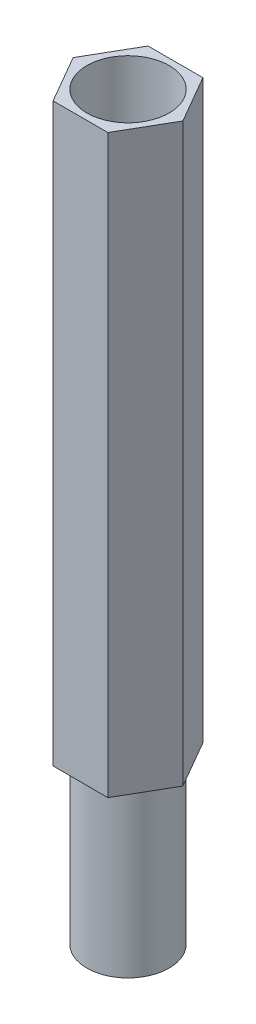
ISO-10303-21;
HEADER;
FILE_DESCRIPTION(('STEP AP214'),'2;1');
FILE_NAME('part.step','',(''),(''),'','','');
FILE_SCHEMA(('AUTOMOTIVE_DESIGN { 1 0 10303 214 1 1 1 1 }'));
ENDSEC;
DATA;
#1=APPLICATION_CONTEXT('core data for automotive mechanical design processes');
#2=APPLICATION_PROTOCOL_DEFINITION('international standard','automotive_design',2000,#1);
#3=PRODUCT_CONTEXT('',#1,'mechanical');
#4=PRODUCT('Part','Part','',(#3));
#5=PRODUCT_RELATED_PRODUCT_CATEGORY('part','',(#4));
#6=PRODUCT_DEFINITION_FORMATION('','',#4);
#7=PRODUCT_DEFINITION_CONTEXT('part definition',#1,'design');
#8=PRODUCT_DEFINITION('design','',#6,#7);
#9=PRODUCT_DEFINITION_SHAPE('','',#8);
#10=(LENGTH_UNIT() NAMED_UNIT(*) SI_UNIT(.MILLI.,.METRE.));
#11=(NAMED_UNIT(*) PLANE_ANGLE_UNIT() SI_UNIT($,.RADIAN.));
#12=(NAMED_UNIT(*) SI_UNIT($,.STERADIAN.) SOLID_ANGLE_UNIT());
#13=UNCERTAINTY_MEASURE_WITH_UNIT(LENGTH_MEASURE(1.E-05),#10,'distance_accuracy_value','');
#14=(GEOMETRIC_REPRESENTATION_CONTEXT(3) GLOBAL_UNCERTAINTY_ASSIGNED_CONTEXT((#13)) GLOBAL_UNIT_ASSIGNED_CONTEXT((#10,
#11,#12)) REPRESENTATION_CONTEXT('',''));
#15=CARTESIAN_POINT('',(0.,0.,0.));
#16=DIRECTION('',(0.,0.,1.));
#17=DIRECTION('',(1.,0.,0.));
#18=AXIS2_PLACEMENT_3D('',#15,#16,#17);
#19=CARTESIAN_POINT('',(0.,21.,0.));
#20=DIRECTION('',(0.,-1.,0.));
#21=DIRECTION('',(0.,0.,-1.));
#22=AXIS2_PLACEMENT_3D('',#19,#20,#21);
#23=PLANE('',#22);
#24=DIRECTION('',(-1.,0.,0.));
#25=VECTOR('',#24,1.);
#26=CARTESIAN_POINT('',(1.00000000000005,21.,1.73205080756897));
#27=LINE('',#26,#25);
#28=CARTESIAN_POINT('',(1.00000000000005,21.,1.73205080756897));
#29=VERTEX_POINT('',#28);
#30=CARTESIAN_POINT('',(-0.999999999999947,21.,1.73205080756897));
#31=VERTEX_POINT('',#30);
#32=EDGE_CURVE('E145',#29,#31,#27,.T.);
#33=ORIENTED_EDGE('',*,*,#32,.F.);
#34=DIRECTION('',(-0.5,0.,0.866025403784439));
#35=VECTOR('',#34,1.);
#36=CARTESIAN_POINT('',(2.00000000000011,21.,0.));
#37=LINE('',#36,#35);
#38=CARTESIAN_POINT('',(2.00000000000011,21.,0.));
#39=VERTEX_POINT('',#38);
#40=EDGE_CURVE('E119',#39,#29,#37,.T.);
#41=ORIENTED_EDGE('',*,*,#40,.F.);
#42=DIRECTION('',(0.5,0.,0.866025403784439));
#43=VECTOR('',#42,1.);
#44=CARTESIAN_POINT('',(1.00000000000005,21.,-1.73205080756897));
#45=LINE('',#44,#43);
#46=CARTESIAN_POINT('',(1.00000000000005,21.,-1.73205080756897));
#47=VERTEX_POINT('',#46);
#48=EDGE_CURVE('E104',#47,#39,#45,.T.);
#49=ORIENTED_EDGE('',*,*,#48,.F.);
#50=DIRECTION('',(1.,0.,0.));
#51=VECTOR('',#50,1.);
#52=CARTESIAN_POINT('',(-0.999999999999947,21.,-1.73205080756897));
#53=LINE('',#52,#51);
#54=CARTESIAN_POINT('',(-0.999999999999947,21.,-1.73205080756897));
#55=VERTEX_POINT('',#54);
#56=EDGE_CURVE('E117',#55,#47,#53,.T.);
#57=ORIENTED_EDGE('',*,*,#56,.F.);
#58=DIRECTION('',(0.5,0.,-0.866025403784439));
#59=VECTOR('',#58,1.);
#60=CARTESIAN_POINT('',(-2.,21.,0.));
#61=LINE('',#60,#59);
#62=CARTESIAN_POINT('',(-2.,21.,0.));
#63=VERTEX_POINT('',#62);
#64=EDGE_CURVE('E122',#63,#55,#61,.T.);
#65=ORIENTED_EDGE('',*,*,#64,.F.);
#66=DIRECTION('',(-0.5,0.,-0.866025403784439));
#67=VECTOR('',#66,1.);
#68=CARTESIAN_POINT('',(-0.999999999999947,21.,1.73205080756897));
#69=LINE('',#68,#67);
#70=EDGE_CURVE('E124',#31,#63,#69,.T.);
#71=ORIENTED_EDGE('',*,*,#70,.F.);
#72=EDGE_LOOP('',(#33,#41,#49,#57,#65,#71));
#73=FACE_BOUND('',#72,.T.);
#74=CARTESIAN_POINT('',(0.,21.,0.));
#75=DIRECTION('',(0.,1.,0.));
#76=DIRECTION('',(0.,0.,1.));
#77=AXIS2_PLACEMENT_3D('',#74,#75,#76);
#78=CIRCLE('',#77,1.49999999999999);
#79=CARTESIAN_POINT('',(0.,21.,1.49999999999999));
#80=VERTEX_POINT('',#79);
#81=EDGE_CURVE('E186',#80,#80,#78,.T.);
#82=ORIENTED_EDGE('',*,*,#81,.F.);
#83=EDGE_LOOP('',(#82));
#84=FACE_BOUND('',#83,.T.);
#85=ADVANCED_FACE('F41',(#73,#84),#23,.F.);
#86=CARTESIAN_POINT('',(1.00000000000005,21.,1.73205080756897));
#87=DIRECTION('',(0.,0.,1.));
#88=DIRECTION('',(1.,0.,0.));
#89=AXIS2_PLACEMENT_3D('',#86,#87,#88);
#90=PLANE('',#89);
#91=DIRECTION('',(-1.,0.,0.));
#92=VECTOR('',#91,1.);
#93=CARTESIAN_POINT('',(1.00000000000005,0.,1.73205080756897));
#94=LINE('',#93,#92);
#95=CARTESIAN_POINT('',(1.00000000000005,0.,1.73205080756897));
#96=VERTEX_POINT('',#95);
#97=CARTESIAN_POINT('',(-0.999999999999947,0.,1.73205080756897));
#98=VERTEX_POINT('',#97);
#99=EDGE_CURVE('E129',#96,#98,#94,.T.);
#100=ORIENTED_EDGE('',*,*,#99,.F.);
#101=DIRECTION('',(0.,-1.,0.));
#102=VECTOR('',#101,1.);
#103=CARTESIAN_POINT('',(1.00000000000005,21.,1.73205080756897));
#104=LINE('',#103,#102);
#105=EDGE_CURVE('E51',#29,#96,#104,.T.);
#106=ORIENTED_EDGE('',*,*,#105,.F.);
#107=ORIENTED_EDGE('',*,*,#32,.T.);
#108=DIRECTION('',(0.,-1.,0.));
#109=VECTOR('',#108,1.);
#110=CARTESIAN_POINT('',(-0.999999999999947,21.,1.73205080756897));
#111=LINE('',#110,#109);
#112=EDGE_CURVE('E45',#31,#98,#111,.T.);
#113=ORIENTED_EDGE('',*,*,#112,.T.);
#114=EDGE_LOOP('',(#100,#106,#107,#113));
#115=FACE_BOUND('',#114,.T.);
#116=ADVANCED_FACE('F43',(#115),#90,.T.);
#117=CARTESIAN_POINT('',(2.00000000000011,21.,0.));
#118=DIRECTION('',(0.866025403784439,0.,0.5));
#119=DIRECTION('',(0.5,0.,-0.866025403784439));
#120=AXIS2_PLACEMENT_3D('',#117,#118,#119);
#121=PLANE('',#120);
#122=DIRECTION('',(-0.5,0.,0.866025403784439));
#123=VECTOR('',#122,1.);
#124=CARTESIAN_POINT('',(2.00000000000011,0.,0.));
#125=LINE('',#124,#123);
#126=CARTESIAN_POINT('',(2.00000000000011,0.,0.));
#127=VERTEX_POINT('',#126);
#128=EDGE_CURVE('E142',#127,#96,#125,.T.);
#129=ORIENTED_EDGE('',*,*,#128,.F.);
#130=DIRECTION('',(0.,-1.,0.));
#131=VECTOR('',#130,1.);
#132=CARTESIAN_POINT('',(2.00000000000011,21.,0.));
#133=LINE('',#132,#131);
#134=EDGE_CURVE('E82',#39,#127,#133,.T.);
#135=ORIENTED_EDGE('',*,*,#134,.F.);
#136=ORIENTED_EDGE('',*,*,#40,.T.);
#137=ORIENTED_EDGE('',*,*,#105,.T.);
#138=EDGE_LOOP('',(#129,#135,#136,#137));
#139=FACE_BOUND('',#138,.T.);
#140=ADVANCED_FACE('F153',(#139),#121,.T.);
#141=CARTESIAN_POINT('',(1.00000000000005,21.,-1.73205080756897));
#142=DIRECTION('',(0.866025403784439,0.,-0.5));
#143=DIRECTION('',(-0.5,0.,-0.866025403784439));
#144=AXIS2_PLACEMENT_3D('',#141,#142,#143);
#145=PLANE('',#144);
#146=DIRECTION('',(0.5,0.,0.866025403784439));
#147=VECTOR('',#146,1.);
#148=CARTESIAN_POINT('',(1.00000000000005,0.,-1.73205080756897));
#149=LINE('',#148,#147);
#150=CARTESIAN_POINT('',(1.00000000000005,0.,-1.73205080756897));
#151=VERTEX_POINT('',#150);
#152=EDGE_CURVE('E106',#151,#127,#149,.T.);
#153=ORIENTED_EDGE('',*,*,#152,.F.);
#154=DIRECTION('',(0.,-1.,0.));
#155=VECTOR('',#154,1.);
#156=CARTESIAN_POINT('',(1.00000000000005,21.,-1.73205080756897));
#157=LINE('',#156,#155);
#158=EDGE_CURVE('E101',#47,#151,#157,.T.);
#159=ORIENTED_EDGE('',*,*,#158,.F.);
#160=ORIENTED_EDGE('',*,*,#48,.T.);
#161=ORIENTED_EDGE('',*,*,#134,.T.);
#162=EDGE_LOOP('',(#153,#159,#160,#161));
#163=FACE_BOUND('',#162,.T.);
#164=ADVANCED_FACE('F103',(#163),#145,.T.);
#165=CARTESIAN_POINT('',(-0.999999999999947,21.,-1.73205080756897));
#166=DIRECTION('',(0.,0.,-1.));
#167=DIRECTION('',(-1.,0.,0.));
#168=AXIS2_PLACEMENT_3D('',#165,#166,#167);
#169=PLANE('',#168);
#170=DIRECTION('',(1.,0.,0.));
#171=VECTOR('',#170,1.);
#172=CARTESIAN_POINT('',(-0.999999999999947,0.,-1.73205080756897));
#173=LINE('',#172,#171);
#174=CARTESIAN_POINT('',(-0.999999999999947,0.,-1.73205080756897));
#175=VERTEX_POINT('',#174);
#176=EDGE_CURVE('E139',#175,#151,#173,.T.);
#177=ORIENTED_EDGE('',*,*,#176,.F.);
#178=DIRECTION('',(0.,-1.,0.));
#179=VECTOR('',#178,1.);
#180=CARTESIAN_POINT('',(-0.999999999999947,21.,-1.73205080756897));
#181=LINE('',#180,#179);
#182=EDGE_CURVE('E111',#55,#175,#181,.T.);
#183=ORIENTED_EDGE('',*,*,#182,.F.);
#184=ORIENTED_EDGE('',*,*,#56,.T.);
#185=ORIENTED_EDGE('',*,*,#158,.T.);
#186=EDGE_LOOP('',(#177,#183,#184,#185));
#187=FACE_BOUND('',#186,.T.);
#188=ADVANCED_FACE('F121',(#187),#169,.T.);
#189=CARTESIAN_POINT('',(-2.,21.,0.));
#190=DIRECTION('',(-0.866025403784439,0.,-0.5));
#191=DIRECTION('',(-0.5,0.,0.866025403784439));
#192=AXIS2_PLACEMENT_3D('',#189,#190,#191);
#193=PLANE('',#192);
#194=DIRECTION('',(0.5,0.,-0.866025403784439));
#195=VECTOR('',#194,1.);
#196=CARTESIAN_POINT('',(-2.,0.,0.));
#197=LINE('',#196,#195);
#198=CARTESIAN_POINT('',(-2.,0.,0.));
#199=VERTEX_POINT('',#198);
#200=EDGE_CURVE('E136',#199,#175,#197,.T.);
#201=ORIENTED_EDGE('',*,*,#200,.F.);
#202=DIRECTION('',(0.,-1.,0.));
#203=VECTOR('',#202,1.);
#204=CARTESIAN_POINT('',(-2.,21.,0.));
#205=LINE('',#204,#203);
#206=EDGE_CURVE('E148',#63,#199,#205,.T.);
#207=ORIENTED_EDGE('',*,*,#206,.F.);
#208=ORIENTED_EDGE('',*,*,#64,.T.);
#209=ORIENTED_EDGE('',*,*,#182,.T.);
#210=EDGE_LOOP('',(#201,#207,#208,#209));
#211=FACE_BOUND('',#210,.T.);
#212=ADVANCED_FACE('F177',(#211),#193,.T.);
#213=CARTESIAN_POINT('',(-0.999999999999947,21.,1.73205080756897));
#214=DIRECTION('',(-0.866025403784439,0.,0.5));
#215=DIRECTION('',(0.5,0.,0.866025403784439));
#216=AXIS2_PLACEMENT_3D('',#213,#214,#215);
#217=PLANE('',#216);
#218=DIRECTION('',(-0.5,0.,-0.866025403784439));
#219=VECTOR('',#218,1.);
#220=CARTESIAN_POINT('',(-0.999999999999947,0.,1.73205080756897));
#221=LINE('',#220,#219);
#222=EDGE_CURVE('E132',#98,#199,#221,.T.);
#223=ORIENTED_EDGE('',*,*,#222,.F.);
#224=ORIENTED_EDGE('',*,*,#112,.F.);
#225=ORIENTED_EDGE('',*,*,#70,.T.);
#226=ORIENTED_EDGE('',*,*,#206,.T.);
#227=EDGE_LOOP('',(#223,#224,#225,#226));
#228=FACE_BOUND('',#227,.T.);
#229=ADVANCED_FACE('F150',(#228),#217,.T.);
#230=CARTESIAN_POINT('',(0.,0.,0.));
#231=DIRECTION('',(0.,-1.,0.));
#232=DIRECTION('',(0.,0.,-1.));
#233=AXIS2_PLACEMENT_3D('',#230,#231,#232);
#234=PLANE('',#233);
#235=CARTESIAN_POINT('',(0.,0.,0.));
#236=DIRECTION('',(0.,-1.,0.));
#237=DIRECTION('',(0.,0.,-1.));
#238=AXIS2_PLACEMENT_3D('',#235,#236,#237);
#239=CIRCLE('',#238,1.5);
#240=CARTESIAN_POINT('',(0.,0.,-1.5));
#241=VERTEX_POINT('',#240);
#242=EDGE_CURVE('E11',#241,#241,#239,.T.);
#243=ORIENTED_EDGE('',*,*,#242,.F.);
#244=EDGE_LOOP('',(#243));
#245=FACE_BOUND('',#244,.T.);
#246=ORIENTED_EDGE('',*,*,#99,.T.);
#247=ORIENTED_EDGE('',*,*,#222,.T.);
#248=ORIENTED_EDGE('',*,*,#200,.T.);
#249=ORIENTED_EDGE('',*,*,#176,.T.);
#250=ORIENTED_EDGE('',*,*,#152,.T.);
#251=ORIENTED_EDGE('',*,*,#128,.T.);
#252=EDGE_LOOP('',(#246,#247,#248,#249,#250,#251));
#253=FACE_BOUND('',#252,.T.);
#254=ADVANCED_FACE('F152',(#245,#253),#234,.T.);
#255=CARTESIAN_POINT('',(0.,0.,0.));
#256=DIRECTION('',(0.,-1.,0.));
#257=DIRECTION('',(0.,0.,-1.));
#258=AXIS2_PLACEMENT_3D('',#255,#256,#257);
#259=CYLINDRICAL_SURFACE('',#258,1.5);
#260=ORIENTED_EDGE('',*,*,#242,.T.);
#261=EDGE_LOOP('',(#260));
#262=FACE_BOUND('',#261,.T.);
#263=CARTESIAN_POINT('',(0.,-6.,0.));
#264=DIRECTION('',(0.,-1.,0.));
#265=DIRECTION('',(0.,0.,-1.));
#266=AXIS2_PLACEMENT_3D('',#263,#264,#265);
#267=CIRCLE('',#266,1.5);
#268=CARTESIAN_POINT('',(0.,-6.,-1.5));
#269=VERTEX_POINT('',#268);
#270=EDGE_CURVE('E133',#269,#269,#267,.T.);
#271=ORIENTED_EDGE('',*,*,#270,.F.);
#272=EDGE_LOOP('',(#271));
#273=FACE_BOUND('',#272,.T.);
#274=ADVANCED_FACE('F167',(#262,#273),#259,.T.);
#275=CARTESIAN_POINT('',(0.,-6.,0.));
#276=DIRECTION('',(0.,-1.,0.));
#277=DIRECTION('',(0.,0.,-1.));
#278=AXIS2_PLACEMENT_3D('',#275,#276,#277);
#279=PLANE('',#278);
#280=ORIENTED_EDGE('',*,*,#270,.T.);
#281=EDGE_LOOP('',(#280));
#282=FACE_BOUND('',#281,.T.);
#283=ADVANCED_FACE('F175',(#282),#279,.T.);
#284=CARTESIAN_POINT('',(0.,16.,0.));
#285=DIRECTION('',(0.,-1.,0.));
#286=DIRECTION('',(0.,0.,-1.));
#287=AXIS2_PLACEMENT_3D('',#284,#285,#286);
#288=PLANE('',#287);
#289=CARTESIAN_POINT('',(0.,16.,0.));
#290=DIRECTION('',(0.,1.,0.));
#291=DIRECTION('',(0.,0.,1.));
#292=AXIS2_PLACEMENT_3D('',#289,#290,#291);
#293=CIRCLE('',#292,1.49999999999999);
#294=CARTESIAN_POINT('',(0.,16.,1.49999999999999));
#295=VERTEX_POINT('',#294);
#296=EDGE_CURVE('E183',#295,#295,#293,.T.);
#297=ORIENTED_EDGE('',*,*,#296,.T.);
#298=EDGE_LOOP('',(#297));
#299=FACE_BOUND('',#298,.T.);
#300=ADVANCED_FACE('F254',(#299),#288,.F.);
#301=CARTESIAN_POINT('',(0.,21.,0.));
#302=DIRECTION('',(0.,1.,0.));
#303=DIRECTION('',(0.,0.,1.));
#304=AXIS2_PLACEMENT_3D('',#301,#302,#303);
#305=CYLINDRICAL_SURFACE('',#304,1.49999999999999);
#306=ORIENTED_EDGE('',*,*,#296,.F.);
#307=EDGE_LOOP('',(#306));
#308=FACE_BOUND('',#307,.T.);
#309=ORIENTED_EDGE('',*,*,#81,.T.);
#310=EDGE_LOOP('',(#309));
#311=FACE_BOUND('',#310,.T.);
#312=ADVANCED_FACE('F269',(#308,#311),#305,.F.);
#313=CLOSED_SHELL('',(#85,#116,#140,#164,#188,#212,#229,#254,#274,#283,#300,#312));
#314=MANIFOLD_SOLID_BREP('B2',#313);
#315=ADVANCED_BREP_SHAPE_REPRESENTATION('',(#18,#314),#14);
#316=SHAPE_DEFINITION_REPRESENTATION(#9,#315);
ENDSEC;
END-ISO-10303-21;
